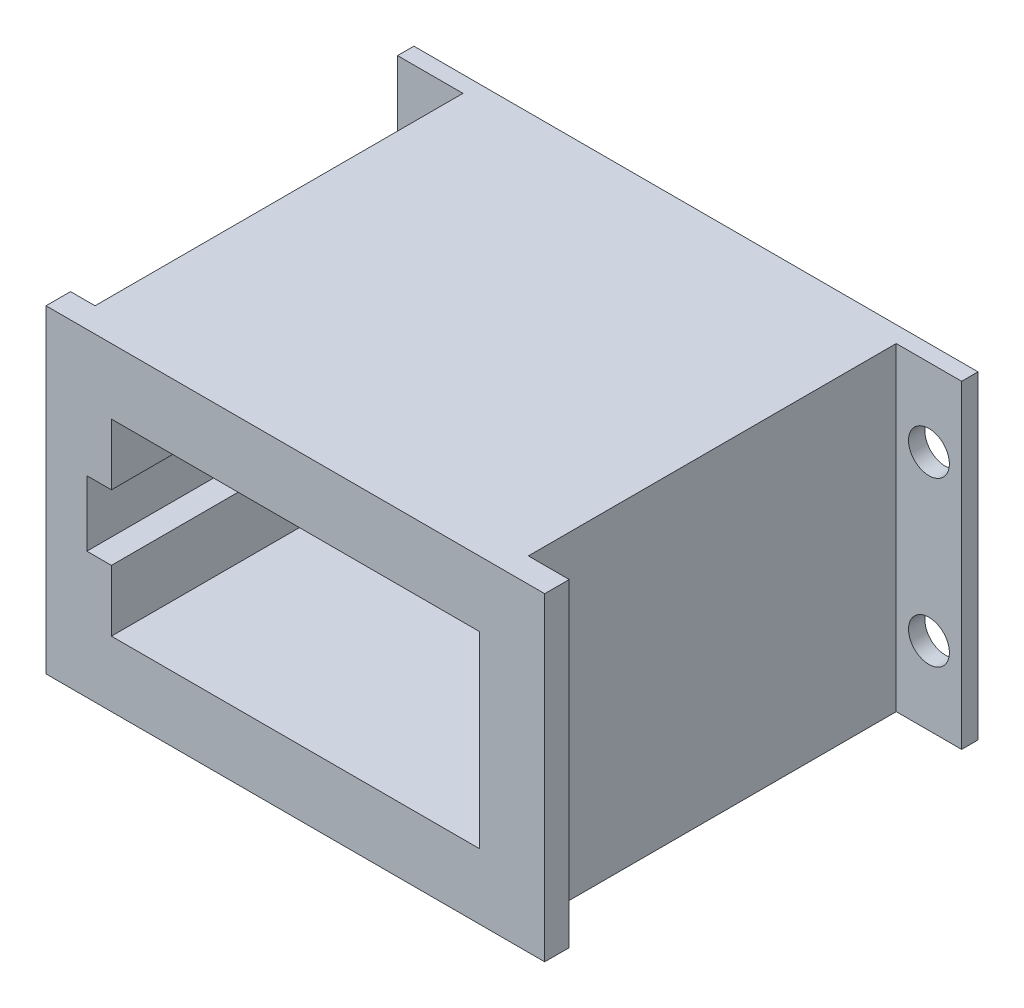
ISO-10303-21;
HEADER;
FILE_DESCRIPTION(('STEP AP214'),'2;1');
FILE_NAME('part.step','',(''),(''),'','','');
FILE_SCHEMA(('AUTOMOTIVE_DESIGN { 1 0 10303 214 1 1 1 1 }'));
ENDSEC;
DATA;
#1=APPLICATION_CONTEXT('core data for automotive mechanical design processes');
#2=APPLICATION_PROTOCOL_DEFINITION('international standard','automotive_design',2000,#1);
#3=PRODUCT_CONTEXT('',#1,'mechanical');
#4=PRODUCT('Part','Part','',(#3));
#5=PRODUCT_RELATED_PRODUCT_CATEGORY('part','',(#4));
#6=PRODUCT_DEFINITION_FORMATION('','',#4);
#7=PRODUCT_DEFINITION_CONTEXT('part definition',#1,'design');
#8=PRODUCT_DEFINITION('design','',#6,#7);
#9=PRODUCT_DEFINITION_SHAPE('','',#8);
#10=(LENGTH_UNIT() NAMED_UNIT(*) SI_UNIT(.MILLI.,.METRE.));
#11=(NAMED_UNIT(*) PLANE_ANGLE_UNIT() SI_UNIT($,.RADIAN.));
#12=(NAMED_UNIT(*) SI_UNIT($,.STERADIAN.) SOLID_ANGLE_UNIT());
#13=UNCERTAINTY_MEASURE_WITH_UNIT(LENGTH_MEASURE(1.E-05),#10,'distance_accuracy_value','');
#14=(GEOMETRIC_REPRESENTATION_CONTEXT(3) GLOBAL_UNCERTAINTY_ASSIGNED_CONTEXT((#13)) GLOBAL_UNIT_ASSIGNED_CONTEXT((#10,
#11,#12)) REPRESENTATION_CONTEXT('',''));
#15=CARTESIAN_POINT('',(0.,0.,0.));
#16=DIRECTION('',(0.,0.,1.));
#17=DIRECTION('',(1.,0.,0.));
#18=AXIS2_PLACEMENT_3D('',#15,#16,#17);
#19=CARTESIAN_POINT('',(-8.,-31.,50.));
#20=DIRECTION('',(1.,0.,0.));
#21=DIRECTION('',(0.,0.,-1.));
#22=AXIS2_PLACEMENT_3D('',#19,#20,#21);
#23=PLANE('',#22);
#24=DIRECTION('',(0.,1.,0.));
#25=VECTOR('',#24,1.);
#26=CARTESIAN_POINT('',(-8.,-42.,47.));
#27=LINE('',#26,#25);
#28=CARTESIAN_POINT('',(-8.,-31.,47.));
#29=VERTEX_POINT('',#28);
#30=CARTESIAN_POINT('',(-8.,8.,47.));
#31=VERTEX_POINT('',#30);
#32=EDGE_CURVE('E53',#29,#31,#27,.T.);
#33=ORIENTED_EDGE('',*,*,#32,.F.);
#34=DIRECTION('',(0.,0.,-1.));
#35=VECTOR('',#34,1.);
#36=CARTESIAN_POINT('',(-8.,-31.,50.));
#37=LINE('',#36,#35);
#38=CARTESIAN_POINT('',(-8.,-31.,50.));
#39=VERTEX_POINT('',#38);
#40=EDGE_CURVE('E39',#39,#29,#37,.T.);
#41=ORIENTED_EDGE('',*,*,#40,.F.);
#42=DIRECTION('',(0.,-1.,0.));
#43=VECTOR('',#42,1.);
#44=CARTESIAN_POINT('',(-8.,0.5,50.));
#45=LINE('',#44,#43);
#46=CARTESIAN_POINT('',(-8.,8.,50.));
#47=VERTEX_POINT('',#46);
#48=EDGE_CURVE('E179',#47,#39,#45,.T.);
#49=ORIENTED_EDGE('',*,*,#48,.F.);
#50=DIRECTION('',(0.,0.,-1.));
#51=VECTOR('',#50,1.);
#52=CARTESIAN_POINT('',(-8.,8.,50.));
#53=LINE('',#52,#51);
#54=EDGE_CURVE('E316',#47,#31,#53,.T.);
#55=ORIENTED_EDGE('',*,*,#54,.T.);
#56=EDGE_LOOP('',(#33,#41,#49,#55));
#57=FACE_BOUND('',#56,.T.);
#58=ADVANCED_FACE('F32',(#57),#23,.F.);
#59=CARTESIAN_POINT('',(53.,-31.,50.));
#60=DIRECTION('',(0.,1.,0.));
#61=DIRECTION('',(0.,0.,1.));
#62=AXIS2_PLACEMENT_3D('',#59,#60,#61);
#63=PLANE('',#62);
#64=DIRECTION('',(0.,0.,1.));
#65=VECTOR('',#64,1.);
#66=CARTESIAN_POINT('',(-4.99999999999999,-31.,50.));
#67=LINE('',#66,#65);
#68=CARTESIAN_POINT('',(-5.,-31.,2.));
#69=VERTEX_POINT('',#68);
#70=CARTESIAN_POINT('',(-4.99999999999999,-31.,47.));
#71=VERTEX_POINT('',#70);
#72=EDGE_CURVE('E246',#69,#71,#67,.T.);
#73=ORIENTED_EDGE('',*,*,#72,.F.);
#74=DIRECTION('',(1.,0.,0.));
#75=VECTOR('',#74,1.);
#76=CARTESIAN_POINT('',(53.,-31.,1.99999999999999));
#77=LINE('',#76,#75);
#78=CARTESIAN_POINT('',(-13.,-31.,2.));
#79=VERTEX_POINT('',#78);
#80=EDGE_CURVE('E248',#79,#69,#77,.T.);
#81=ORIENTED_EDGE('',*,*,#80,.F.);
#82=DIRECTION('',(0.,0.,-1.));
#83=VECTOR('',#82,1.);
#84=CARTESIAN_POINT('',(-13.,-31.,2.));
#85=LINE('',#84,#83);
#86=CARTESIAN_POINT('',(-13.,-31.,0.));
#87=VERTEX_POINT('',#86);
#88=EDGE_CURVE('E201',#79,#87,#85,.T.);
#89=ORIENTED_EDGE('',*,*,#88,.T.);
#90=DIRECTION('',(1.,0.,0.));
#91=VECTOR('',#90,1.);
#92=CARTESIAN_POINT('',(53.,-31.,0.));
#93=LINE('',#92,#91);
#94=CARTESIAN_POINT('',(56.,-31.,0.));
#95=VERTEX_POINT('',#94);
#96=EDGE_CURVE('E180',#87,#95,#93,.T.);
#97=ORIENTED_EDGE('',*,*,#96,.T.);
#98=DIRECTION('',(0.,0.,1.));
#99=VECTOR('',#98,1.);
#100=CARTESIAN_POINT('',(56.,-31.,2.));
#101=LINE('',#100,#99);
#102=CARTESIAN_POINT('',(56.,-31.,2.));
#103=VERTEX_POINT('',#102);
#104=EDGE_CURVE('E204',#95,#103,#101,.T.);
#105=ORIENTED_EDGE('',*,*,#104,.T.);
#106=DIRECTION('',(-1.,0.,0.));
#107=VECTOR('',#106,1.);
#108=CARTESIAN_POINT('',(53.0000000000001,-31.,2.));
#109=LINE('',#108,#107);
#110=CARTESIAN_POINT('',(48.,-31.,1.99999999999999));
#111=VERTEX_POINT('',#110);
#112=EDGE_CURVE('E230',#103,#111,#109,.T.);
#113=ORIENTED_EDGE('',*,*,#112,.T.);
#114=DIRECTION('',(0.,0.,1.));
#115=VECTOR('',#114,1.);
#116=CARTESIAN_POINT('',(48.,-31.,1.99999999999999));
#117=LINE('',#116,#115);
#118=CARTESIAN_POINT('',(48.,-31.,47.));
#119=VERTEX_POINT('',#118);
#120=EDGE_CURVE('E214',#111,#119,#117,.T.);
#121=ORIENTED_EDGE('',*,*,#120,.T.);
#122=DIRECTION('',(1.,0.,0.));
#123=VECTOR('',#122,1.);
#124=CARTESIAN_POINT('',(53.,-31.,47.));
#125=LINE('',#124,#123);
#126=CARTESIAN_POINT('',(53.,-31.,47.));
#127=VERTEX_POINT('',#126);
#128=EDGE_CURVE('E227',#119,#127,#125,.T.);
#129=ORIENTED_EDGE('',*,*,#128,.T.);
#130=DIRECTION('',(0.,0.,-1.));
#131=VECTOR('',#130,1.);
#132=CARTESIAN_POINT('',(53.,-31.,50.));
#133=LINE('',#132,#131);
#134=CARTESIAN_POINT('',(53.,-31.,50.));
#135=VERTEX_POINT('',#134);
#136=EDGE_CURVE('E323',#135,#127,#133,.T.);
#137=ORIENTED_EDGE('',*,*,#136,.F.);
#138=DIRECTION('',(1.,0.,0.));
#139=VECTOR('',#138,1.);
#140=CARTESIAN_POINT('',(53.,-31.,50.));
#141=LINE('',#140,#139);
#142=EDGE_CURVE('E310',#39,#135,#141,.T.);
#143=ORIENTED_EDGE('',*,*,#142,.F.);
#144=ORIENTED_EDGE('',*,*,#40,.T.);
#145=DIRECTION('',(-1.,0.,0.));
#146=VECTOR('',#145,1.);
#147=CARTESIAN_POINT('',(53.,-31.,47.));
#148=LINE('',#147,#146);
#149=EDGE_CURVE('E241',#71,#29,#148,.T.);
#150=ORIENTED_EDGE('',*,*,#149,.F.);
#151=EDGE_LOOP('',(#73,#81,#89,#97,#105,#113,#121,#129,#137,#143,#144,#150));
#152=FACE_BOUND('',#151,.T.);
#153=ADVANCED_FACE('F331',(#152),#63,.F.);
#154=CARTESIAN_POINT('',(-8.,8.,50.));
#155=DIRECTION('',(0.,-1.,0.));
#156=DIRECTION('',(0.,0.,-1.));
#157=AXIS2_PLACEMENT_3D('',#154,#155,#156);
#158=PLANE('',#157);
#159=DIRECTION('',(-1.,0.,0.));
#160=VECTOR('',#159,1.);
#161=CARTESIAN_POINT('',(-8.,8.,0.));
#162=LINE('',#161,#160);
#163=CARTESIAN_POINT('',(56.,8.,0.));
#164=VERTEX_POINT('',#163);
#165=CARTESIAN_POINT('',(-13.,8.,0.));
#166=VERTEX_POINT('',#165);
#167=EDGE_CURVE('E168',#164,#166,#162,.T.);
#168=ORIENTED_EDGE('',*,*,#167,.T.);
#169=DIRECTION('',(0.,0.,1.));
#170=VECTOR('',#169,1.);
#171=CARTESIAN_POINT('',(-13.,8.,2.));
#172=LINE('',#171,#170);
#173=CARTESIAN_POINT('',(-13.,8.,2.));
#174=VERTEX_POINT('',#173);
#175=EDGE_CURVE('E173',#166,#174,#172,.T.);
#176=ORIENTED_EDGE('',*,*,#175,.T.);
#177=DIRECTION('',(1.,0.,0.));
#178=VECTOR('',#177,1.);
#179=CARTESIAN_POINT('',(0.,8.,2.));
#180=LINE('',#179,#178);
#181=CARTESIAN_POINT('',(-5.,8.,2.));
#182=VERTEX_POINT('',#181);
#183=EDGE_CURVE('E232',#174,#182,#180,.T.);
#184=ORIENTED_EDGE('',*,*,#183,.T.);
#185=DIRECTION('',(0.,0.,1.));
#186=VECTOR('',#185,1.);
#187=CARTESIAN_POINT('',(-5.,8.,0.));
#188=LINE('',#187,#186);
#189=CARTESIAN_POINT('',(-4.99999999999999,8.,47.));
#190=VERTEX_POINT('',#189);
#191=EDGE_CURVE('E236',#182,#190,#188,.T.);
#192=ORIENTED_EDGE('',*,*,#191,.T.);
#193=DIRECTION('',(-1.,0.,0.));
#194=VECTOR('',#193,1.);
#195=CARTESIAN_POINT('',(0.,8.,47.));
#196=LINE('',#195,#194);
#197=EDGE_CURVE('E234',#190,#31,#196,.T.);
#198=ORIENTED_EDGE('',*,*,#197,.T.);
#199=ORIENTED_EDGE('',*,*,#54,.F.);
#200=DIRECTION('',(-1.,0.,0.));
#201=VECTOR('',#200,1.);
#202=CARTESIAN_POINT('',(-8.,8.,50.));
#203=LINE('',#202,#201);
#204=CARTESIAN_POINT('',(53.,8.,50.));
#205=VERTEX_POINT('',#204);
#206=EDGE_CURVE('E314',#205,#47,#203,.T.);
#207=ORIENTED_EDGE('',*,*,#206,.F.);
#208=DIRECTION('',(0.,0.,-1.));
#209=VECTOR('',#208,1.);
#210=CARTESIAN_POINT('',(53.,8.,50.));
#211=LINE('',#210,#209);
#212=CARTESIAN_POINT('',(53.,8.,47.));
#213=VERTEX_POINT('',#212);
#214=EDGE_CURVE('E320',#205,#213,#211,.T.);
#215=ORIENTED_EDGE('',*,*,#214,.T.);
#216=DIRECTION('',(1.,0.,0.));
#217=VECTOR('',#216,1.);
#218=CARTESIAN_POINT('',(-5.43546689139393E-13,8.,46.9999999999994));
#219=LINE('',#218,#217);
#220=CARTESIAN_POINT('',(48.,8.,47.));
#221=VERTEX_POINT('',#220);
#222=EDGE_CURVE('E46',#221,#213,#219,.T.);
#223=ORIENTED_EDGE('',*,*,#222,.F.);
#224=DIRECTION('',(0.,0.,1.));
#225=VECTOR('',#224,1.);
#226=CARTESIAN_POINT('',(48.,8.,1.99999999999999));
#227=LINE('',#226,#225);
#228=CARTESIAN_POINT('',(48.,8.,1.99999999999999));
#229=VERTEX_POINT('',#228);
#230=EDGE_CURVE('E207',#229,#221,#227,.T.);
#231=ORIENTED_EDGE('',*,*,#230,.F.);
#232=DIRECTION('',(-1.,0.,0.));
#233=VECTOR('',#232,1.);
#234=CARTESIAN_POINT('',(0.,8.,1.99999999999984));
#235=LINE('',#234,#233);
#236=CARTESIAN_POINT('',(56.,8.,2.));
#237=VERTEX_POINT('',#236);
#238=EDGE_CURVE('E225',#237,#229,#235,.T.);
#239=ORIENTED_EDGE('',*,*,#238,.F.);
#240=DIRECTION('',(0.,0.,-1.));
#241=VECTOR('',#240,1.);
#242=CARTESIAN_POINT('',(56.,8.,2.));
#243=LINE('',#242,#241);
#244=EDGE_CURVE('E175',#237,#164,#243,.T.);
#245=ORIENTED_EDGE('',*,*,#244,.T.);
#246=EDGE_LOOP('',(#168,#176,#184,#192,#198,#199,#207,#215,#223,#231,#239,#245));
#247=FACE_BOUND('',#246,.T.);
#248=ADVANCED_FACE('F170',(#247),#158,.F.);
#249=CARTESIAN_POINT('',(0.,0.,50.));
#250=DIRECTION('',(0.,0.,-1.));
#251=DIRECTION('',(-1.,0.,0.));
#252=AXIS2_PLACEMENT_3D('',#249,#250,#251);
#253=PLANE('',#252);
#254=ORIENTED_EDGE('',*,*,#48,.T.);
#255=ORIENTED_EDGE('',*,*,#142,.T.);
#256=DIRECTION('',(0.,1.,0.));
#257=VECTOR('',#256,1.);
#258=CARTESIAN_POINT('',(53.,8.,50.));
#259=LINE('',#258,#257);
#260=EDGE_CURVE('E312',#135,#205,#259,.T.);
#261=ORIENTED_EDGE('',*,*,#260,.T.);
#262=ORIENTED_EDGE('',*,*,#206,.T.);
#263=EDGE_LOOP('',(#254,#255,#261,#262));
#264=FACE_BOUND('',#263,.T.);
#265=DIRECTION('',(0.,-1.,0.));
#266=VECTOR('',#265,1.);
#267=CARTESIAN_POINT('',(0.,-7.5,50.));
#268=LINE('',#267,#266);
#269=CARTESIAN_POINT('',(0.,0.,50.));
#270=VERTEX_POINT('',#269);
#271=CARTESIAN_POINT('',(0.,-7.5,50.));
#272=VERTEX_POINT('',#271);
#273=EDGE_CURVE('E251',#270,#272,#268,.T.);
#274=ORIENTED_EDGE('',*,*,#273,.F.);
#275=DIRECTION('',(-1.,0.,0.));
#276=VECTOR('',#275,1.);
#277=CARTESIAN_POINT('',(0.,0.,50.));
#278=LINE('',#277,#276);
#279=CARTESIAN_POINT('',(45.,0.,50.));
#280=VERTEX_POINT('',#279);
#281=EDGE_CURVE('E267',#280,#270,#278,.T.);
#282=ORIENTED_EDGE('',*,*,#281,.F.);
#283=DIRECTION('',(0.,1.,0.));
#284=VECTOR('',#283,1.);
#285=CARTESIAN_POINT('',(45.,0.,50.));
#286=LINE('',#285,#284);
#287=CARTESIAN_POINT('',(45.,-23.,50.));
#288=VERTEX_POINT('',#287);
#289=EDGE_CURVE('E264',#288,#280,#286,.T.);
#290=ORIENTED_EDGE('',*,*,#289,.F.);
#291=DIRECTION('',(1.,0.,0.));
#292=VECTOR('',#291,1.);
#293=CARTESIAN_POINT('',(45.,-23.,50.));
#294=LINE('',#293,#292);
#295=CARTESIAN_POINT('',(0.,-23.,50.));
#296=VERTEX_POINT('',#295);
#297=EDGE_CURVE('E262',#296,#288,#294,.T.);
#298=ORIENTED_EDGE('',*,*,#297,.F.);
#299=DIRECTION('',(0.,-1.,0.));
#300=VECTOR('',#299,1.);
#301=CARTESIAN_POINT('',(0.,-23.,50.));
#302=LINE('',#301,#300);
#303=CARTESIAN_POINT('',(0.,-15.5,50.));
#304=VERTEX_POINT('',#303);
#305=EDGE_CURVE('E260',#304,#296,#302,.T.);
#306=ORIENTED_EDGE('',*,*,#305,.F.);
#307=DIRECTION('',(1.,0.,0.));
#308=VECTOR('',#307,1.);
#309=CARTESIAN_POINT('',(0.,-15.5,50.));
#310=LINE('',#309,#308);
#311=CARTESIAN_POINT('',(-3.,-15.5,50.));
#312=VERTEX_POINT('',#311);
#313=EDGE_CURVE('E258',#312,#304,#310,.T.);
#314=ORIENTED_EDGE('',*,*,#313,.F.);
#315=DIRECTION('',(0.,-1.,0.));
#316=VECTOR('',#315,1.);
#317=CARTESIAN_POINT('',(-3.,-7.5,50.));
#318=LINE('',#317,#316);
#319=CARTESIAN_POINT('',(-3.,-7.5,50.));
#320=VERTEX_POINT('',#319);
#321=EDGE_CURVE('E256',#320,#312,#318,.T.);
#322=ORIENTED_EDGE('',*,*,#321,.F.);
#323=DIRECTION('',(-1.,0.,0.));
#324=VECTOR('',#323,1.);
#325=CARTESIAN_POINT('',(0.,-7.5,50.));
#326=LINE('',#325,#324);
#327=EDGE_CURVE('E253',#272,#320,#326,.T.);
#328=ORIENTED_EDGE('',*,*,#327,.F.);
#329=EDGE_LOOP('',(#274,#282,#290,#298,#306,#314,#322,#328));
#330=FACE_BOUND('',#329,.T.);
#331=ADVANCED_FACE('F367',(#264,#330),#253,.F.);
#332=CARTESIAN_POINT('',(0.,0.,0.));
#333=DIRECTION('',(0.,0.,-1.));
#334=DIRECTION('',(-1.,0.,0.));
#335=AXIS2_PLACEMENT_3D('',#332,#333,#334);
#336=PLANE('',#335);
#337=CARTESIAN_POINT('',(-9.00000000000001,-1.5,0.));
#338=DIRECTION('',(0.,0.,-1.));
#339=DIRECTION('',(-1.,0.,0.));
#340=AXIS2_PLACEMENT_3D('',#337,#338,#339);
#341=CIRCLE('',#340,2.5);
#342=CARTESIAN_POINT('',(-11.5,-1.5,0.));
#343=VERTEX_POINT('',#342);
#344=EDGE_CURVE('E586',#343,#343,#341,.T.);
#345=ORIENTED_EDGE('',*,*,#344,.F.);
#346=EDGE_LOOP('',(#345));
#347=FACE_BOUND('',#346,.T.);
#348=CARTESIAN_POINT('',(-9.00000000000001,-21.5,0.));
#349=DIRECTION('',(0.,0.,-1.));
#350=DIRECTION('',(-1.,0.,0.));
#351=AXIS2_PLACEMENT_3D('',#348,#349,#350);
#352=CIRCLE('',#351,2.5);
#353=CARTESIAN_POINT('',(-11.5,-21.5,0.));
#354=VERTEX_POINT('',#353);
#355=EDGE_CURVE('E590',#354,#354,#352,.T.);
#356=ORIENTED_EDGE('',*,*,#355,.F.);
#357=EDGE_LOOP('',(#356));
#358=FACE_BOUND('',#357,.T.);
#359=CARTESIAN_POINT('',(52.,-21.5,0.));
#360=DIRECTION('',(0.,0.,-1.));
#361=DIRECTION('',(-1.,0.,0.));
#362=AXIS2_PLACEMENT_3D('',#359,#360,#361);
#363=CIRCLE('',#362,2.5);
#364=CARTESIAN_POINT('',(49.5,-21.5,0.));
#365=VERTEX_POINT('',#364);
#366=EDGE_CURVE('E596',#365,#365,#363,.T.);
#367=ORIENTED_EDGE('',*,*,#366,.F.);
#368=EDGE_LOOP('',(#367));
#369=FACE_BOUND('',#368,.T.);
#370=CARTESIAN_POINT('',(52.,-1.5,0.));
#371=DIRECTION('',(0.,0.,-1.));
#372=DIRECTION('',(-1.,0.,0.));
#373=AXIS2_PLACEMENT_3D('',#370,#371,#372);
#374=CIRCLE('',#373,2.5);
#375=CARTESIAN_POINT('',(49.5,-1.5,0.));
#376=VERTEX_POINT('',#375);
#377=EDGE_CURVE('E197',#376,#376,#374,.T.);
#378=ORIENTED_EDGE('',*,*,#377,.F.);
#379=EDGE_LOOP('',(#378));
#380=FACE_BOUND('',#379,.T.);
#381=DIRECTION('',(0.,1.,0.));
#382=VECTOR('',#381,1.);
#383=CARTESIAN_POINT('',(56.,-34.605551275464,0.));
#384=LINE('',#383,#382);
#385=EDGE_CURVE('E208',#95,#164,#384,.T.);
#386=ORIENTED_EDGE('',*,*,#385,.F.);
#387=ORIENTED_EDGE('',*,*,#96,.F.);
#388=DIRECTION('',(0.,1.,0.));
#389=VECTOR('',#388,1.);
#390=CARTESIAN_POINT('',(-13.,-39.2462112512353,0.));
#391=LINE('',#390,#389);
#392=EDGE_CURVE('E183',#87,#166,#391,.T.);
#393=ORIENTED_EDGE('',*,*,#392,.T.);
#394=ORIENTED_EDGE('',*,*,#167,.F.);
#395=EDGE_LOOP('',(#386,#387,#393,#394));
#396=FACE_BOUND('',#395,.T.);
#397=DIRECTION('',(-1.,0.,0.));
#398=VECTOR('',#397,1.);
#399=CARTESIAN_POINT('',(0.,0.,0.));
#400=LINE('',#399,#398);
#401=CARTESIAN_POINT('',(45.,0.,0.));
#402=VERTEX_POINT('',#401);
#403=CARTESIAN_POINT('',(0.,0.,0.));
#404=VERTEX_POINT('',#403);
#405=EDGE_CURVE('E254',#402,#404,#400,.T.);
#406=ORIENTED_EDGE('',*,*,#405,.T.);
#407=DIRECTION('',(0.,-1.,0.));
#408=VECTOR('',#407,1.);
#409=CARTESIAN_POINT('',(0.,-7.5,0.));
#410=LINE('',#409,#408);
#411=CARTESIAN_POINT('',(0.,-7.5,0.));
#412=VERTEX_POINT('',#411);
#413=EDGE_CURVE('E250',#404,#412,#410,.T.);
#414=ORIENTED_EDGE('',*,*,#413,.T.);
#415=DIRECTION('',(-1.,0.,0.));
#416=VECTOR('',#415,1.);
#417=CARTESIAN_POINT('',(0.,-7.5,0.));
#418=LINE('',#417,#416);
#419=CARTESIAN_POINT('',(-3.,-7.5,0.));
#420=VERTEX_POINT('',#419);
#421=EDGE_CURVE('E272',#412,#420,#418,.T.);
#422=ORIENTED_EDGE('',*,*,#421,.T.);
#423=DIRECTION('',(0.,-1.,0.));
#424=VECTOR('',#423,1.);
#425=CARTESIAN_POINT('',(-3.,-7.5,0.));
#426=LINE('',#425,#424);
#427=CARTESIAN_POINT('',(-3.,-15.5,0.));
#428=VERTEX_POINT('',#427);
#429=EDGE_CURVE('E275',#420,#428,#426,.T.);
#430=ORIENTED_EDGE('',*,*,#429,.T.);
#431=DIRECTION('',(1.,0.,0.));
#432=VECTOR('',#431,1.);
#433=CARTESIAN_POINT('',(0.,-15.5,0.));
#434=LINE('',#433,#432);
#435=CARTESIAN_POINT('',(0.,-15.5,0.));
#436=VERTEX_POINT('',#435);
#437=EDGE_CURVE('E278',#428,#436,#434,.T.);
#438=ORIENTED_EDGE('',*,*,#437,.T.);
#439=DIRECTION('',(0.,-1.,0.));
#440=VECTOR('',#439,1.);
#441=CARTESIAN_POINT('',(0.,-23.,0.));
#442=LINE('',#441,#440);
#443=CARTESIAN_POINT('',(0.,-23.,0.));
#444=VERTEX_POINT('',#443);
#445=EDGE_CURVE('E281',#436,#444,#442,.T.);
#446=ORIENTED_EDGE('',*,*,#445,.T.);
#447=DIRECTION('',(1.,0.,0.));
#448=VECTOR('',#447,1.);
#449=CARTESIAN_POINT('',(45.,-23.,0.));
#450=LINE('',#449,#448);
#451=CARTESIAN_POINT('',(45.,-23.,0.));
#452=VERTEX_POINT('',#451);
#453=EDGE_CURVE('E284',#444,#452,#450,.T.);
#454=ORIENTED_EDGE('',*,*,#453,.T.);
#455=DIRECTION('',(0.,1.,0.));
#456=VECTOR('',#455,1.);
#457=CARTESIAN_POINT('',(45.,0.,0.));
#458=LINE('',#457,#456);
#459=EDGE_CURVE('E287',#452,#402,#458,.T.);
#460=ORIENTED_EDGE('',*,*,#459,.T.);
#461=EDGE_LOOP('',(#406,#414,#422,#430,#438,#446,#454,#460));
#462=FACE_BOUND('',#461,.T.);
#463=ADVANCED_FACE('F184',(#347,#358,#369,#380,#396,#462),#336,.T.);
#464=CARTESIAN_POINT('',(53.,8.,50.));
#465=DIRECTION('',(-1.,0.,0.));
#466=DIRECTION('',(0.,0.,1.));
#467=AXIS2_PLACEMENT_3D('',#464,#465,#466);
#468=PLANE('',#467);
#469=ORIENTED_EDGE('',*,*,#136,.T.);
#470=DIRECTION('',(0.,1.,0.));
#471=VECTOR('',#470,1.);
#472=CARTESIAN_POINT('',(53.,8.,47.));
#473=LINE('',#472,#471);
#474=EDGE_CURVE('E11',#127,#213,#473,.T.);
#475=ORIENTED_EDGE('',*,*,#474,.T.);
#476=ORIENTED_EDGE('',*,*,#214,.F.);
#477=ORIENTED_EDGE('',*,*,#260,.F.);
#478=EDGE_LOOP('',(#469,#475,#476,#477));
#479=FACE_BOUND('',#478,.T.);
#480=ADVANCED_FACE('F370',(#479),#468,.F.);
#481=CARTESIAN_POINT('',(0.,-7.5,50.));
#482=DIRECTION('',(1.,0.,0.));
#483=DIRECTION('',(0.,0.,-1.));
#484=AXIS2_PLACEMENT_3D('',#481,#482,#483);
#485=PLANE('',#484);
#486=ORIENTED_EDGE('',*,*,#413,.F.);
#487=DIRECTION('',(0.,0.,-1.));
#488=VECTOR('',#487,1.);
#489=CARTESIAN_POINT('',(0.,0.,50.));
#490=LINE('',#489,#488);
#491=EDGE_CURVE('E269',#270,#404,#490,.T.);
#492=ORIENTED_EDGE('',*,*,#491,.F.);
#493=ORIENTED_EDGE('',*,*,#273,.T.);
#494=DIRECTION('',(0.,0.,-1.));
#495=VECTOR('',#494,1.);
#496=CARTESIAN_POINT('',(0.,-7.5,50.));
#497=LINE('',#496,#495);
#498=EDGE_CURVE('E306',#272,#412,#497,.T.);
#499=ORIENTED_EDGE('',*,*,#498,.T.);
#500=EDGE_LOOP('',(#486,#492,#493,#499));
#501=FACE_BOUND('',#500,.T.);
#502=ADVANCED_FACE('F372',(#501),#485,.T.);
#503=CARTESIAN_POINT('',(0.,-7.5,50.));
#504=DIRECTION('',(0.,-1.,0.));
#505=DIRECTION('',(0.,0.,-1.));
#506=AXIS2_PLACEMENT_3D('',#503,#504,#505);
#507=PLANE('',#506);
#508=ORIENTED_EDGE('',*,*,#421,.F.);
#509=ORIENTED_EDGE('',*,*,#498,.F.);
#510=ORIENTED_EDGE('',*,*,#327,.T.);
#511=DIRECTION('',(0.,0.,-1.));
#512=VECTOR('',#511,1.);
#513=CARTESIAN_POINT('',(-3.,-7.5,50.));
#514=LINE('',#513,#512);
#515=EDGE_CURVE('E304',#320,#420,#514,.T.);
#516=ORIENTED_EDGE('',*,*,#515,.T.);
#517=EDGE_LOOP('',(#508,#509,#510,#516));
#518=FACE_BOUND('',#517,.T.);
#519=ADVANCED_FACE('F383',(#518),#507,.T.);
#520=CARTESIAN_POINT('',(-3.,-7.5,50.));
#521=DIRECTION('',(1.,0.,0.));
#522=DIRECTION('',(0.,0.,-1.));
#523=AXIS2_PLACEMENT_3D('',#520,#521,#522);
#524=PLANE('',#523);
#525=ORIENTED_EDGE('',*,*,#429,.F.);
#526=ORIENTED_EDGE('',*,*,#515,.F.);
#527=ORIENTED_EDGE('',*,*,#321,.T.);
#528=DIRECTION('',(0.,0.,-1.));
#529=VECTOR('',#528,1.);
#530=CARTESIAN_POINT('',(-3.,-15.5,50.));
#531=LINE('',#530,#529);
#532=EDGE_CURVE('E302',#312,#428,#531,.T.);
#533=ORIENTED_EDGE('',*,*,#532,.T.);
#534=EDGE_LOOP('',(#525,#526,#527,#533));
#535=FACE_BOUND('',#534,.T.);
#536=ADVANCED_FACE('F387',(#535),#524,.T.);
#537=CARTESIAN_POINT('',(0.,-15.5,50.));
#538=DIRECTION('',(0.,1.,0.));
#539=DIRECTION('',(0.,0.,1.));
#540=AXIS2_PLACEMENT_3D('',#537,#538,#539);
#541=PLANE('',#540);
#542=ORIENTED_EDGE('',*,*,#437,.F.);
#543=ORIENTED_EDGE('',*,*,#532,.F.);
#544=ORIENTED_EDGE('',*,*,#313,.T.);
#545=DIRECTION('',(0.,0.,-1.));
#546=VECTOR('',#545,1.);
#547=CARTESIAN_POINT('',(0.,-15.5,50.));
#548=LINE('',#547,#546);
#549=EDGE_CURVE('E300',#304,#436,#548,.T.);
#550=ORIENTED_EDGE('',*,*,#549,.T.);
#551=EDGE_LOOP('',(#542,#543,#544,#550));
#552=FACE_BOUND('',#551,.T.);
#553=ADVANCED_FACE('F391',(#552),#541,.T.);
#554=CARTESIAN_POINT('',(0.,-23.,50.));
#555=DIRECTION('',(1.,0.,0.));
#556=DIRECTION('',(0.,0.,-1.));
#557=AXIS2_PLACEMENT_3D('',#554,#555,#556);
#558=PLANE('',#557);
#559=ORIENTED_EDGE('',*,*,#445,.F.);
#560=ORIENTED_EDGE('',*,*,#549,.F.);
#561=ORIENTED_EDGE('',*,*,#305,.T.);
#562=DIRECTION('',(0.,0.,-1.));
#563=VECTOR('',#562,1.);
#564=CARTESIAN_POINT('',(0.,-23.,50.));
#565=LINE('',#564,#563);
#566=EDGE_CURVE('E298',#296,#444,#565,.T.);
#567=ORIENTED_EDGE('',*,*,#566,.T.);
#568=EDGE_LOOP('',(#559,#560,#561,#567));
#569=FACE_BOUND('',#568,.T.);
#570=ADVANCED_FACE('F395',(#569),#558,.T.);
#571=CARTESIAN_POINT('',(45.,-23.,50.));
#572=DIRECTION('',(0.,1.,0.));
#573=DIRECTION('',(0.,0.,1.));
#574=AXIS2_PLACEMENT_3D('',#571,#572,#573);
#575=PLANE('',#574);
#576=ORIENTED_EDGE('',*,*,#453,.F.);
#577=ORIENTED_EDGE('',*,*,#566,.F.);
#578=ORIENTED_EDGE('',*,*,#297,.T.);
#579=DIRECTION('',(0.,0.,-1.));
#580=VECTOR('',#579,1.);
#581=CARTESIAN_POINT('',(45.,-23.,50.));
#582=LINE('',#581,#580);
#583=EDGE_CURVE('E296',#288,#452,#582,.T.);
#584=ORIENTED_EDGE('',*,*,#583,.T.);
#585=EDGE_LOOP('',(#576,#577,#578,#584));
#586=FACE_BOUND('',#585,.T.);
#587=ADVANCED_FACE('F399',(#586),#575,.T.);
#588=CARTESIAN_POINT('',(45.,0.,50.));
#589=DIRECTION('',(-1.,0.,0.));
#590=DIRECTION('',(0.,0.,1.));
#591=AXIS2_PLACEMENT_3D('',#588,#589,#590);
#592=PLANE('',#591);
#593=ORIENTED_EDGE('',*,*,#459,.F.);
#594=ORIENTED_EDGE('',*,*,#583,.F.);
#595=ORIENTED_EDGE('',*,*,#289,.T.);
#596=DIRECTION('',(0.,0.,-1.));
#597=VECTOR('',#596,1.);
#598=CARTESIAN_POINT('',(45.,0.,50.));
#599=LINE('',#598,#597);
#600=EDGE_CURVE('E294',#280,#402,#599,.T.);
#601=ORIENTED_EDGE('',*,*,#600,.T.);
#602=EDGE_LOOP('',(#593,#594,#595,#601));
#603=FACE_BOUND('',#602,.T.);
#604=ADVANCED_FACE('F354',(#603),#592,.T.);
#605=CARTESIAN_POINT('',(0.,0.,50.));
#606=DIRECTION('',(0.,-1.,0.));
#607=DIRECTION('',(0.,0.,-1.));
#608=AXIS2_PLACEMENT_3D('',#605,#606,#607);
#609=PLANE('',#608);
#610=ORIENTED_EDGE('',*,*,#405,.F.);
#611=ORIENTED_EDGE('',*,*,#600,.F.);
#612=ORIENTED_EDGE('',*,*,#281,.T.);
#613=ORIENTED_EDGE('',*,*,#491,.T.);
#614=EDGE_LOOP('',(#610,#611,#612,#613));
#615=FACE_BOUND('',#614,.T.);
#616=ADVANCED_FACE('F346',(#615),#609,.T.);
#617=CARTESIAN_POINT('',(0.,-42.,2.));
#618=DIRECTION('',(0.,0.,1.));
#619=DIRECTION('',(1.,0.,0.));
#620=AXIS2_PLACEMENT_3D('',#617,#618,#619);
#621=PLANE('',#620);
#622=CARTESIAN_POINT('',(-9.00000000000001,-1.5,1.99999999999999));
#623=DIRECTION('',(0.,0.,1.));
#624=DIRECTION('',(1.,0.,0.));
#625=AXIS2_PLACEMENT_3D('',#622,#623,#624);
#626=CIRCLE('',#625,2.5);
#627=CARTESIAN_POINT('',(-6.50000000000001,-1.5,1.99999999999999));
#628=VERTEX_POINT('',#627);
#629=EDGE_CURVE('E583',#628,#628,#626,.F.);
#630=ORIENTED_EDGE('',*,*,#629,.T.);
#631=EDGE_LOOP('',(#630));
#632=FACE_BOUND('',#631,.T.);
#633=CARTESIAN_POINT('',(-9.00000000000001,-21.5,1.99999999999999));
#634=DIRECTION('',(0.,0.,1.));
#635=DIRECTION('',(1.,0.,0.));
#636=AXIS2_PLACEMENT_3D('',#633,#634,#635);
#637=CIRCLE('',#636,2.5);
#638=CARTESIAN_POINT('',(-6.50000000000001,-21.5,1.99999999999999));
#639=VERTEX_POINT('',#638);
#640=EDGE_CURVE('E587',#639,#639,#637,.F.);
#641=ORIENTED_EDGE('',*,*,#640,.T.);
#642=EDGE_LOOP('',(#641));
#643=FACE_BOUND('',#642,.T.);
#644=ORIENTED_EDGE('',*,*,#80,.T.);
#645=DIRECTION('',(0.,1.,0.));
#646=VECTOR('',#645,1.);
#647=CARTESIAN_POINT('',(-5.,-42.,2.));
#648=LINE('',#647,#646);
#649=EDGE_CURVE('E239',#69,#182,#648,.T.);
#650=ORIENTED_EDGE('',*,*,#649,.T.);
#651=ORIENTED_EDGE('',*,*,#183,.F.);
#652=DIRECTION('',(0.,1.,0.));
#653=VECTOR('',#652,1.);
#654=CARTESIAN_POINT('',(-13.,-39.2462112512353,2.));
#655=LINE('',#654,#653);
#656=EDGE_CURVE('E189',#79,#174,#655,.T.);
#657=ORIENTED_EDGE('',*,*,#656,.F.);
#658=EDGE_LOOP('',(#644,#650,#651,#657));
#659=FACE_BOUND('',#658,.T.);
#660=ADVANCED_FACE('F344',(#632,#643,#659),#621,.T.);
#661=CARTESIAN_POINT('',(-5.,-42.,0.));
#662=DIRECTION('',(-1.,0.,0.));
#663=DIRECTION('',(0.,0.,1.));
#664=AXIS2_PLACEMENT_3D('',#661,#662,#663);
#665=PLANE('',#664);
#666=ORIENTED_EDGE('',*,*,#72,.T.);
#667=DIRECTION('',(0.,1.,0.));
#668=VECTOR('',#667,1.);
#669=CARTESIAN_POINT('',(-4.99999999999999,-42.,47.));
#670=LINE('',#669,#668);
#671=EDGE_CURVE('E242',#71,#190,#670,.T.);
#672=ORIENTED_EDGE('',*,*,#671,.T.);
#673=ORIENTED_EDGE('',*,*,#191,.F.);
#674=ORIENTED_EDGE('',*,*,#649,.F.);
#675=EDGE_LOOP('',(#666,#672,#673,#674));
#676=FACE_BOUND('',#675,.T.);
#677=ADVANCED_FACE('F341',(#676),#665,.T.);
#678=CARTESIAN_POINT('',(0.,-42.,47.));
#679=DIRECTION('',(0.,0.,-1.));
#680=DIRECTION('',(-1.,0.,0.));
#681=AXIS2_PLACEMENT_3D('',#678,#679,#680);
#682=PLANE('',#681);
#683=ORIENTED_EDGE('',*,*,#149,.T.);
#684=ORIENTED_EDGE('',*,*,#32,.T.);
#685=ORIENTED_EDGE('',*,*,#197,.F.);
#686=ORIENTED_EDGE('',*,*,#671,.F.);
#687=EDGE_LOOP('',(#683,#684,#685,#686));
#688=FACE_BOUND('',#687,.T.);
#689=ADVANCED_FACE('F339',(#688),#682,.T.);
#690=CARTESIAN_POINT('',(0.,-42.,1.99999999999984));
#691=DIRECTION('',(0.,0.,-1.));
#692=DIRECTION('',(-1.,0.,0.));
#693=AXIS2_PLACEMENT_3D('',#690,#691,#692);
#694=PLANE('',#693);
#695=CARTESIAN_POINT('',(52.,-21.5,2.));
#696=DIRECTION('',(0.,0.,-1.));
#697=DIRECTION('',(-1.,0.,0.));
#698=AXIS2_PLACEMENT_3D('',#695,#696,#697);
#699=CIRCLE('',#698,2.5);
#700=CARTESIAN_POINT('',(49.5,-21.5,1.99999999999999));
#701=VERTEX_POINT('',#700);
#702=EDGE_CURVE('E597',#701,#701,#699,.F.);
#703=ORIENTED_EDGE('',*,*,#702,.F.);
#704=EDGE_LOOP('',(#703));
#705=FACE_BOUND('',#704,.T.);
#706=CARTESIAN_POINT('',(52.,-1.5,2.));
#707=DIRECTION('',(0.,0.,-1.));
#708=DIRECTION('',(-1.,0.,0.));
#709=AXIS2_PLACEMENT_3D('',#706,#707,#708);
#710=CIRCLE('',#709,2.5);
#711=CARTESIAN_POINT('',(49.5,-1.5,1.99999999999999));
#712=VERTEX_POINT('',#711);
#713=EDGE_CURVE('E194',#712,#712,#710,.F.);
#714=ORIENTED_EDGE('',*,*,#713,.F.);
#715=EDGE_LOOP('',(#714));
#716=FACE_BOUND('',#715,.T.);
#717=ORIENTED_EDGE('',*,*,#112,.F.);
#718=DIRECTION('',(0.,1.,0.));
#719=VECTOR('',#718,1.);
#720=CARTESIAN_POINT('',(56.,-34.605551275464,2.));
#721=LINE('',#720,#719);
#722=EDGE_CURVE('E210',#103,#237,#721,.T.);
#723=ORIENTED_EDGE('',*,*,#722,.T.);
#724=ORIENTED_EDGE('',*,*,#238,.T.);
#725=DIRECTION('',(0.,1.,0.));
#726=VECTOR('',#725,1.);
#727=CARTESIAN_POINT('',(48.,-31.,1.99999999999999));
#728=LINE('',#727,#726);
#729=EDGE_CURVE('E217',#111,#229,#728,.T.);
#730=ORIENTED_EDGE('',*,*,#729,.F.);
#731=EDGE_LOOP('',(#717,#723,#724,#730));
#732=FACE_BOUND('',#731,.T.);
#733=ADVANCED_FACE('F466',(#705,#716,#732),#694,.F.);
#734=CARTESIAN_POINT('',(-5.43546689139393E-13,-42.,46.9999999999994));
#735=DIRECTION('',(0.,0.,1.));
#736=DIRECTION('',(1.,0.,0.));
#737=AXIS2_PLACEMENT_3D('',#734,#735,#736);
#738=PLANE('',#737);
#739=ORIENTED_EDGE('',*,*,#128,.F.);
#740=DIRECTION('',(0.,1.,0.));
#741=VECTOR('',#740,1.);
#742=CARTESIAN_POINT('',(48.,-31.,47.));
#743=LINE('',#742,#741);
#744=EDGE_CURVE('E220',#119,#221,#743,.T.);
#745=ORIENTED_EDGE('',*,*,#744,.T.);
#746=ORIENTED_EDGE('',*,*,#222,.T.);
#747=ORIENTED_EDGE('',*,*,#474,.F.);
#748=EDGE_LOOP('',(#739,#745,#746,#747));
#749=FACE_BOUND('',#748,.T.);
#750=ADVANCED_FACE('F472',(#749),#738,.F.);
#751=CARTESIAN_POINT('',(48.,-31.,1.99999999999999));
#752=DIRECTION('',(-1.,0.,0.));
#753=DIRECTION('',(0.,0.,1.));
#754=AXIS2_PLACEMENT_3D('',#751,#752,#753);
#755=PLANE('',#754);
#756=ORIENTED_EDGE('',*,*,#230,.T.);
#757=ORIENTED_EDGE('',*,*,#744,.F.);
#758=ORIENTED_EDGE('',*,*,#120,.F.);
#759=ORIENTED_EDGE('',*,*,#729,.T.);
#760=EDGE_LOOP('',(#756,#757,#758,#759));
#761=FACE_BOUND('',#760,.T.);
#762=ADVANCED_FACE('F477',(#761),#755,.F.);
#763=CARTESIAN_POINT('',(56.,-34.605551275464,2.));
#764=DIRECTION('',(1.,0.,0.));
#765=DIRECTION('',(0.,0.,-1.));
#766=AXIS2_PLACEMENT_3D('',#763,#764,#765);
#767=PLANE('',#766);
#768=ORIENTED_EDGE('',*,*,#104,.F.);
#769=ORIENTED_EDGE('',*,*,#385,.T.);
#770=ORIENTED_EDGE('',*,*,#244,.F.);
#771=ORIENTED_EDGE('',*,*,#722,.F.);
#772=EDGE_LOOP('',(#768,#769,#770,#771));
#773=FACE_BOUND('',#772,.T.);
#774=ADVANCED_FACE('F488',(#773),#767,.T.);
#775=CARTESIAN_POINT('',(-13.,-39.2462112512353,2.));
#776=DIRECTION('',(-1.,0.,0.));
#777=DIRECTION('',(0.,0.,1.));
#778=AXIS2_PLACEMENT_3D('',#775,#776,#777);
#779=PLANE('',#778);
#780=ORIENTED_EDGE('',*,*,#88,.F.);
#781=ORIENTED_EDGE('',*,*,#656,.T.);
#782=ORIENTED_EDGE('',*,*,#175,.F.);
#783=ORIENTED_EDGE('',*,*,#392,.F.);
#784=EDGE_LOOP('',(#780,#781,#782,#783));
#785=FACE_BOUND('',#784,.T.);
#786=ADVANCED_FACE('F192',(#785),#779,.T.);
#787=CARTESIAN_POINT('',(52.,-1.5,50.001));
#788=DIRECTION('',(0.,0.,-1.));
#789=DIRECTION('',(-1.,0.,0.));
#790=AXIS2_PLACEMENT_3D('',#787,#788,#789);
#791=CYLINDRICAL_SURFACE('',#790,2.5);
#792=ORIENTED_EDGE('',*,*,#377,.T.);
#793=EDGE_LOOP('',(#792));
#794=FACE_BOUND('',#793,.T.);
#795=ORIENTED_EDGE('',*,*,#713,.T.);
#796=EDGE_LOOP('',(#795));
#797=FACE_BOUND('',#796,.T.);
#798=ADVANCED_FACE('F521',(#794,#797),#791,.F.);
#799=CARTESIAN_POINT('',(52.,-21.5,50.001));
#800=DIRECTION('',(0.,0.,-1.));
#801=DIRECTION('',(-1.,0.,0.));
#802=AXIS2_PLACEMENT_3D('',#799,#800,#801);
#803=CYLINDRICAL_SURFACE('',#802,2.5);
#804=ORIENTED_EDGE('',*,*,#366,.T.);
#805=EDGE_LOOP('',(#804));
#806=FACE_BOUND('',#805,.T.);
#807=ORIENTED_EDGE('',*,*,#702,.T.);
#808=EDGE_LOOP('',(#807));
#809=FACE_BOUND('',#808,.T.);
#810=ADVANCED_FACE('F547',(#806,#809),#803,.F.);
#811=CARTESIAN_POINT('',(-9.00000000000001,-21.5,50.001));
#812=DIRECTION('',(0.,0.,-1.));
#813=DIRECTION('',(-1.,0.,0.));
#814=AXIS2_PLACEMENT_3D('',#811,#812,#813);
#815=CYLINDRICAL_SURFACE('',#814,2.5);
#816=ORIENTED_EDGE('',*,*,#640,.F.);
#817=EDGE_LOOP('',(#816));
#818=FACE_BOUND('',#817,.T.);
#819=ORIENTED_EDGE('',*,*,#355,.T.);
#820=EDGE_LOOP('',(#819));
#821=FACE_BOUND('',#820,.T.);
#822=ADVANCED_FACE('F557',(#818,#821),#815,.F.);
#823=CARTESIAN_POINT('',(-9.00000000000001,-1.5,50.001));
#824=DIRECTION('',(0.,0.,-1.));
#825=DIRECTION('',(-1.,0.,0.));
#826=AXIS2_PLACEMENT_3D('',#823,#824,#825);
#827=CYLINDRICAL_SURFACE('',#826,2.5);
#828=ORIENTED_EDGE('',*,*,#629,.F.);
#829=EDGE_LOOP('',(#828));
#830=FACE_BOUND('',#829,.T.);
#831=ORIENTED_EDGE('',*,*,#344,.T.);
#832=EDGE_LOOP('',(#831));
#833=FACE_BOUND('',#832,.T.);
#834=ADVANCED_FACE('F567',(#830,#833),#827,.F.);
#835=CLOSED_SHELL('',(#58,#153,#248,#331,#463,#480,#502,#519,#536,#553,#570,#587,#604,#616,#660,
#677,#689,#733,#750,#762,#774,#786,#798,#810,#822,#834));
#836=MANIFOLD_SOLID_BREP('B2',#835);
#837=ADVANCED_BREP_SHAPE_REPRESENTATION('',(#18,#836),#14);
#838=SHAPE_DEFINITION_REPRESENTATION(#9,#837);
ENDSEC;
END-ISO-10303-21;
